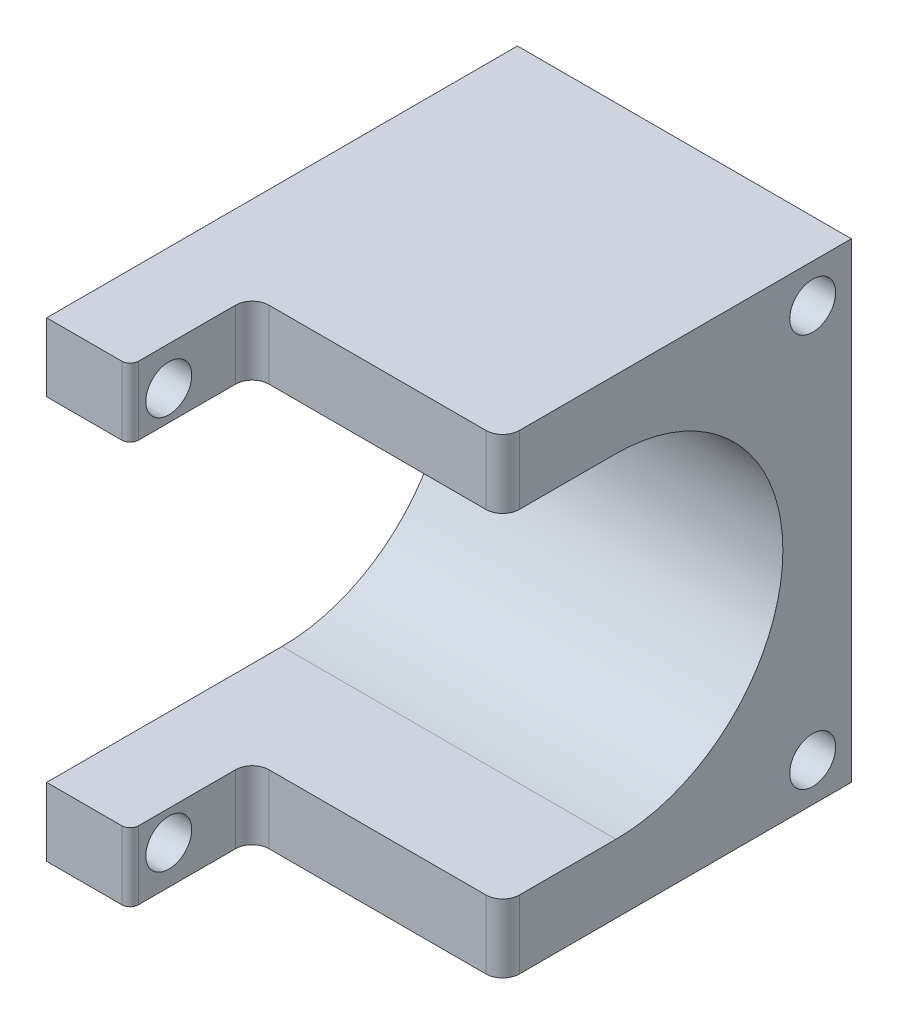
ISO-10303-21;
HEADER;
FILE_DESCRIPTION(('STEP AP214'),'2;1');
FILE_NAME('part.step','',(''),(''),'','','');
FILE_SCHEMA(('AUTOMOTIVE_DESIGN { 1 0 10303 214 1 1 1 1 }'));
ENDSEC;
DATA;
#1=APPLICATION_CONTEXT('core data for automotive mechanical design processes');
#2=APPLICATION_PROTOCOL_DEFINITION('international standard','automotive_design',2000,#1);
#3=PRODUCT_CONTEXT('',#1,'mechanical');
#4=PRODUCT('Part','Part','',(#3));
#5=PRODUCT_RELATED_PRODUCT_CATEGORY('part','',(#4));
#6=PRODUCT_DEFINITION_FORMATION('','',#4);
#7=PRODUCT_DEFINITION_CONTEXT('part definition',#1,'design');
#8=PRODUCT_DEFINITION('design','',#6,#7);
#9=PRODUCT_DEFINITION_SHAPE('','',#8);
#10=(LENGTH_UNIT() NAMED_UNIT(*) SI_UNIT(.MILLI.,.METRE.));
#11=(NAMED_UNIT(*) PLANE_ANGLE_UNIT() SI_UNIT($,.RADIAN.));
#12=(NAMED_UNIT(*) SI_UNIT($,.STERADIAN.) SOLID_ANGLE_UNIT());
#13=UNCERTAINTY_MEASURE_WITH_UNIT(LENGTH_MEASURE(1.E-05),#10,'distance_accuracy_value','');
#14=(GEOMETRIC_REPRESENTATION_CONTEXT(3) GLOBAL_UNCERTAINTY_ASSIGNED_CONTEXT((#13)) GLOBAL_UNIT_ASSIGNED_CONTEXT((#10,
#11,#12)) REPRESENTATION_CONTEXT('',''));
#15=CARTESIAN_POINT('',(0.,0.,0.));
#16=DIRECTION('',(0.,0.,1.));
#17=DIRECTION('',(1.,0.,0.));
#18=AXIS2_PLACEMENT_3D('',#15,#16,#17);
#19=CARTESIAN_POINT('',(40.,1.49681528662421,17.4229299363057));
#20=DIRECTION('',(0.,0.,-1.));
#21=DIRECTION('',(0.,1.,0.));
#22=AXIS2_PLACEMENT_3D('',#19,#20,#21);
#23=PLANE('',#22);
#24=DIRECTION('',(-1.,0.,0.));
#25=VECTOR('',#24,1.);
#26=CARTESIAN_POINT('',(40.,-54.9031847133758,17.4229299363057));
#27=LINE('',#26,#25);
#28=CARTESIAN_POINT('',(9.,-54.9031847133758,17.4229299363057));
#29=VERTEX_POINT('',#28);
#30=CARTESIAN_POINT('',(0.,-54.9031847133758,17.4229299363057));
#31=VERTEX_POINT('',#30);
#32=EDGE_CURVE('E245',#29,#31,#27,.T.);
#33=ORIENTED_EDGE('',*,*,#32,.F.);
#34=DIRECTION('',(0.,1.,0.));
#35=VECTOR('',#34,1.);
#36=CARTESIAN_POINT('',(9.,-46.7031847133758,17.4229299363057));
#37=LINE('',#36,#35);
#38=CARTESIAN_POINT('',(9.,-46.7031847133758,17.4229299363057));
#39=VERTEX_POINT('',#38);
#40=EDGE_CURVE('E285',#29,#39,#37,.T.);
#41=ORIENTED_EDGE('',*,*,#40,.T.);
#42=DIRECTION('',(1.,0.,0.));
#43=VECTOR('',#42,1.);
#44=CARTESIAN_POINT('',(0.,-46.7031847133758,17.4229299363057));
#45=LINE('',#44,#43);
#46=CARTESIAN_POINT('',(0.,-46.7031847133758,17.4229299363057));
#47=VERTEX_POINT('',#46);
#48=EDGE_CURVE('E199',#47,#39,#45,.T.);
#49=ORIENTED_EDGE('',*,*,#48,.F.);
#50=DIRECTION('',(0.,-1.,0.));
#51=VECTOR('',#50,1.);
#52=CARTESIAN_POINT('',(0.,1.49681528662421,17.4229299363057));
#53=LINE('',#52,#51);
#54=EDGE_CURVE('E220',#47,#31,#53,.T.);
#55=ORIENTED_EDGE('',*,*,#54,.T.);
#56=EDGE_LOOP('',(#33,#41,#49,#55));
#57=FACE_BOUND('',#56,.T.);
#58=ADVANCED_FACE('F36',(#57),#23,.F.);
#59=DIRECTION('',(1.,0.,0.));
#60=VECTOR('',#59,1.);
#61=CARTESIAN_POINT('',(0.,-6.70318471337579,17.4229299363057));
#62=LINE('',#61,#60);
#63=CARTESIAN_POINT('',(0.,-6.70318471337579,17.4229299363057));
#64=VERTEX_POINT('',#63);
#65=CARTESIAN_POINT('',(9.,-6.70318471337579,17.4229299363057));
#66=VERTEX_POINT('',#65);
#67=EDGE_CURVE('E172',#64,#66,#62,.T.);
#68=ORIENTED_EDGE('',*,*,#67,.T.);
#69=DIRECTION('',(0.,1.,0.));
#70=VECTOR('',#69,1.);
#71=CARTESIAN_POINT('',(9.,1.49681528662421,17.4229299363057));
#72=LINE('',#71,#70);
#73=CARTESIAN_POINT('',(9.,1.49681528662421,17.4229299363057));
#74=VERTEX_POINT('',#73);
#75=EDGE_CURVE('E294',#66,#74,#72,.T.);
#76=ORIENTED_EDGE('',*,*,#75,.T.);
#77=DIRECTION('',(-1.,0.,0.));
#78=VECTOR('',#77,1.);
#79=CARTESIAN_POINT('',(40.,1.49681528662421,17.4229299363057));
#80=LINE('',#79,#78);
#81=CARTESIAN_POINT('',(0.,1.49681528662421,17.4229299363057));
#82=VERTEX_POINT('',#81);
#83=EDGE_CURVE('E229',#74,#82,#80,.T.);
#84=ORIENTED_EDGE('',*,*,#83,.T.);
#85=EDGE_CURVE('E230',#82,#64,#53,.T.);
#86=ORIENTED_EDGE('',*,*,#85,.T.);
#87=EDGE_LOOP('',(#68,#76,#84,#86));
#88=FACE_BOUND('',#87,.T.);
#89=ADVANCED_FACE('F299',(#88),#23,.F.);
#90=CARTESIAN_POINT('',(0.,-3.13318471337579,12.7929299363057));
#91=DIRECTION('',(1.,0.,0.));
#92=DIRECTION('',(0.,0.,-1.));
#93=AXIS2_PLACEMENT_3D('',#90,#91,#92);
#94=CYLINDRICAL_SURFACE('',#93,2.75);
#95=CARTESIAN_POINT('',(0.,-3.13318471337579,12.7929299363057));
#96=DIRECTION('',(1.,0.,0.));
#97=DIRECTION('',(0.,0.,-1.));
#98=AXIS2_PLACEMENT_3D('',#95,#96,#97);
#99=CIRCLE('',#98,2.75);
#100=CARTESIAN_POINT('',(0.,-3.13318471337579,10.0429299363057));
#101=VERTEX_POINT('',#100);
#102=EDGE_CURVE('E212',#101,#101,#99,.T.);
#103=ORIENTED_EDGE('',*,*,#102,.F.);
#104=EDGE_LOOP('',(#103));
#105=FACE_BOUND('',#104,.T.);
#106=CARTESIAN_POINT('',(10.,-3.13318471337579,12.7929299363057));
#107=DIRECTION('',(1.,0.,0.));
#108=DIRECTION('',(0.,0.,-1.));
#109=AXIS2_PLACEMENT_3D('',#106,#107,#108);
#110=CIRCLE('',#109,2.75);
#111=CARTESIAN_POINT('',(10.,-3.13318471337579,10.0429299363057));
#112=VERTEX_POINT('',#111);
#113=EDGE_CURVE('E354',#112,#112,#110,.F.);
#114=ORIENTED_EDGE('',*,*,#113,.F.);
#115=EDGE_LOOP('',(#114));
#116=FACE_BOUND('',#115,.T.);
#117=ADVANCED_FACE('F373',(#105,#116),#94,.F.);
#118=CARTESIAN_POINT('',(0.,-50.2731847133758,12.7929299363057));
#119=DIRECTION('',(1.,0.,0.));
#120=DIRECTION('',(0.,0.,-1.));
#121=AXIS2_PLACEMENT_3D('',#118,#119,#120);
#122=CYLINDRICAL_SURFACE('',#121,2.75);
#123=CARTESIAN_POINT('',(0.,-50.2731847133758,12.7929299363057));
#124=DIRECTION('',(1.,0.,0.));
#125=DIRECTION('',(0.,0.,1.));
#126=AXIS2_PLACEMENT_3D('',#123,#124,#125);
#127=CIRCLE('',#126,2.75);
#128=CARTESIAN_POINT('',(0.,-50.2731847133758,15.5429299363057));
#129=VERTEX_POINT('',#128);
#130=EDGE_CURVE('E209',#129,#129,#127,.T.);
#131=ORIENTED_EDGE('',*,*,#130,.F.);
#132=EDGE_LOOP('',(#131));
#133=FACE_BOUND('',#132,.T.);
#134=CARTESIAN_POINT('',(10.,-50.2731847133758,12.7929299363057));
#135=DIRECTION('',(1.,0.,0.));
#136=DIRECTION('',(0.,0.,-1.));
#137=AXIS2_PLACEMENT_3D('',#134,#135,#136);
#138=CIRCLE('',#137,2.75);
#139=CARTESIAN_POINT('',(10.,-50.2731847133758,10.0429299363057));
#140=VERTEX_POINT('',#139);
#141=EDGE_CURVE('E190',#140,#140,#138,.F.);
#142=ORIENTED_EDGE('',*,*,#141,.F.);
#143=EDGE_LOOP('',(#142));
#144=FACE_BOUND('',#143,.T.);
#145=ADVANCED_FACE('F371',(#133,#144),#122,.F.);
#146=CARTESIAN_POINT('',(40.,-54.9031847133758,17.4229299363057));
#147=DIRECTION('',(0.,1.,0.));
#148=DIRECTION('',(0.,0.,1.));
#149=AXIS2_PLACEMENT_3D('',#146,#147,#148);
#150=PLANE('',#149);
#151=DIRECTION('',(0.,0.,1.));
#152=VECTOR('',#151,1.);
#153=CARTESIAN_POINT('',(10.,-54.9031847133758,17.4229299363057));
#154=LINE('',#153,#152);
#155=CARTESIAN_POINT('',(10.,-54.9031847133758,4.79292993630573));
#156=VERTEX_POINT('',#155);
#157=CARTESIAN_POINT('',(10.,-54.9031847133758,16.4229299363057));
#158=VERTEX_POINT('',#157);
#159=EDGE_CURVE('E350',#156,#158,#154,.T.);
#160=ORIENTED_EDGE('',*,*,#159,.T.);
#161=CARTESIAN_POINT('',(9.,-54.9031847133758,16.4229299363057));
#162=DIRECTION('',(0.,1.,0.));
#163=DIRECTION('',(0.,0.,1.));
#164=AXIS2_PLACEMENT_3D('',#161,#162,#163);
#165=CIRCLE('',#164,1.);
#166=EDGE_CURVE('E292',#158,#29,#165,.F.);
#167=ORIENTED_EDGE('',*,*,#166,.T.);
#168=ORIENTED_EDGE('',*,*,#32,.T.);
#169=DIRECTION('',(0.,0.,-1.));
#170=VECTOR('',#169,1.);
#171=CARTESIAN_POINT('',(0.,-54.9031847133758,17.4229299363057));
#172=LINE('',#171,#170);
#173=CARTESIAN_POINT('',(0.,-54.9031847133758,-38.9770700636943));
#174=VERTEX_POINT('',#173);
#175=EDGE_CURVE('E232',#31,#174,#172,.T.);
#176=ORIENTED_EDGE('',*,*,#175,.T.);
#177=DIRECTION('',(-1.,0.,0.));
#178=VECTOR('',#177,1.);
#179=CARTESIAN_POINT('',(40.,-54.9031847133758,-38.9770700636943));
#180=LINE('',#179,#178);
#181=CARTESIAN_POINT('',(40.,-54.9031847133758,-38.9770700636943));
#182=VERTEX_POINT('',#181);
#183=EDGE_CURVE('E242',#182,#174,#180,.T.);
#184=ORIENTED_EDGE('',*,*,#183,.F.);
#185=DIRECTION('',(0.,0.,-1.));
#186=VECTOR('',#185,1.);
#187=CARTESIAN_POINT('',(40.,-54.9031847133758,17.4229299363057));
#188=LINE('',#187,#186);
#189=CARTESIAN_POINT('',(40.,-54.9031847133758,0.792929936305732));
#190=VERTEX_POINT('',#189);
#191=EDGE_CURVE('E221',#190,#182,#188,.T.);
#192=ORIENTED_EDGE('',*,*,#191,.F.);
#193=CARTESIAN_POINT('',(38.,-54.9031847133758,0.792929936305727));
#194=DIRECTION('',(0.,1.,0.));
#195=DIRECTION('',(0.,0.,1.));
#196=AXIS2_PLACEMENT_3D('',#193,#194,#195);
#197=CIRCLE('',#196,2.);
#198=CARTESIAN_POINT('',(38.,-54.9031847133758,2.79292993630573));
#199=VERTEX_POINT('',#198);
#200=EDGE_CURVE('E276',#190,#199,#197,.F.);
#201=ORIENTED_EDGE('',*,*,#200,.T.);
#202=DIRECTION('',(1.,0.,0.));
#203=VECTOR('',#202,1.);
#204=CARTESIAN_POINT('',(-16.7713118151205,-54.9031847133758,2.79292993630573));
#205=LINE('',#204,#203);
#206=CARTESIAN_POINT('',(12.,-54.9031847133758,2.79292993630573));
#207=VERTEX_POINT('',#206);
#208=EDGE_CURVE('E360',#207,#199,#205,.T.);
#209=ORIENTED_EDGE('',*,*,#208,.F.);
#210=CARTESIAN_POINT('',(12.,-54.9031847133758,4.79292993630573));
#211=DIRECTION('',(0.,1.,0.));
#212=DIRECTION('',(0.,0.,1.));
#213=AXIS2_PLACEMENT_3D('',#210,#211,#212);
#214=CIRCLE('',#213,2.);
#215=EDGE_CURVE('E259',#207,#156,#214,.T.);
#216=ORIENTED_EDGE('',*,*,#215,.T.);
#217=EDGE_LOOP('',(#160,#167,#168,#176,#184,#192,#201,#209,#216));
#218=FACE_BOUND('',#217,.T.);
#219=ADVANCED_FACE('F315',(#218),#150,.F.);
#220=CARTESIAN_POINT('',(40.,1.49681528662421,-38.9770700636943));
#221=DIRECTION('',(0.,0.,1.));
#222=DIRECTION('',(0.,-1.,0.));
#223=AXIS2_PLACEMENT_3D('',#220,#221,#222);
#224=PLANE('',#223);
#225=DIRECTION('',(0.,1.,0.));
#226=VECTOR('',#225,1.);
#227=CARTESIAN_POINT('',(0.,1.49681528662421,-38.9770700636943));
#228=LINE('',#227,#226);
#229=CARTESIAN_POINT('',(0.,1.49681528662421,-38.9770700636943));
#230=VERTEX_POINT('',#229);
#231=EDGE_CURVE('E234',#174,#230,#228,.T.);
#232=ORIENTED_EDGE('',*,*,#231,.T.);
#233=DIRECTION('',(-1.,0.,0.));
#234=VECTOR('',#233,1.);
#235=CARTESIAN_POINT('',(40.,1.49681528662421,-38.9770700636943));
#236=LINE('',#235,#234);
#237=CARTESIAN_POINT('',(40.,1.49681528662421,-38.9770700636943));
#238=VERTEX_POINT('',#237);
#239=EDGE_CURVE('E239',#238,#230,#236,.T.);
#240=ORIENTED_EDGE('',*,*,#239,.F.);
#241=DIRECTION('',(0.,1.,0.));
#242=VECTOR('',#241,1.);
#243=CARTESIAN_POINT('',(40.,1.49681528662421,-38.9770700636943));
#244=LINE('',#243,#242);
#245=EDGE_CURVE('E223',#182,#238,#244,.T.);
#246=ORIENTED_EDGE('',*,*,#245,.F.);
#247=ORIENTED_EDGE('',*,*,#183,.T.);
#248=EDGE_LOOP('',(#232,#240,#246,#247));
#249=FACE_BOUND('',#248,.T.);
#250=ADVANCED_FACE('F309',(#249),#224,.F.);
#251=CARTESIAN_POINT('',(40.,1.49681528662421,17.4229299363057));
#252=DIRECTION('',(0.,-1.,0.));
#253=DIRECTION('',(0.,0.,-1.));
#254=AXIS2_PLACEMENT_3D('',#251,#252,#253);
#255=PLANE('',#254);
#256=ORIENTED_EDGE('',*,*,#83,.F.);
#257=CARTESIAN_POINT('',(9.,1.49681528662421,16.4229299363057));
#258=DIRECTION('',(0.,-1.,0.));
#259=DIRECTION('',(0.,0.,-1.));
#260=AXIS2_PLACEMENT_3D('',#257,#258,#259);
#261=CIRCLE('',#260,1.);
#262=CARTESIAN_POINT('',(10.,1.49681528662421,16.4229299363057));
#263=VERTEX_POINT('',#262);
#264=EDGE_CURVE('E58',#74,#263,#261,.F.);
#265=ORIENTED_EDGE('',*,*,#264,.T.);
#266=DIRECTION('',(0.,0.,-1.));
#267=VECTOR('',#266,1.);
#268=CARTESIAN_POINT('',(10.,1.49681528662421,17.4229299363057));
#269=LINE('',#268,#267);
#270=CARTESIAN_POINT('',(10.,1.4968152866242,4.79292993630573));
#271=VERTEX_POINT('',#270);
#272=EDGE_CURVE('E346',#263,#271,#269,.T.);
#273=ORIENTED_EDGE('',*,*,#272,.T.);
#274=CARTESIAN_POINT('',(12.,1.49681528662421,4.79292993630573));
#275=DIRECTION('',(0.,-1.,0.));
#276=DIRECTION('',(0.,0.,-1.));
#277=AXIS2_PLACEMENT_3D('',#274,#275,#276);
#278=CIRCLE('',#277,2.);
#279=CARTESIAN_POINT('',(12.,1.4968152866242,2.79292993630573));
#280=VERTEX_POINT('',#279);
#281=EDGE_CURVE('E265',#271,#280,#278,.T.);
#282=ORIENTED_EDGE('',*,*,#281,.T.);
#283=DIRECTION('',(1.,0.,0.));
#284=VECTOR('',#283,1.);
#285=CARTESIAN_POINT('',(-16.7713118151205,1.4968152866242,2.79292993630573));
#286=LINE('',#285,#284);
#287=CARTESIAN_POINT('',(38.,1.4968152866242,2.79292993630573));
#288=VERTEX_POINT('',#287);
#289=EDGE_CURVE('E342',#280,#288,#286,.T.);
#290=ORIENTED_EDGE('',*,*,#289,.T.);
#291=CARTESIAN_POINT('',(38.,1.49681528662421,0.792929936305734));
#292=DIRECTION('',(0.,-1.,0.));
#293=DIRECTION('',(0.,0.,-1.));
#294=AXIS2_PLACEMENT_3D('',#291,#292,#293);
#295=CIRCLE('',#294,2.);
#296=CARTESIAN_POINT('',(40.,1.49681528662421,0.792929936305742));
#297=VERTEX_POINT('',#296);
#298=EDGE_CURVE('E281',#288,#297,#295,.F.);
#299=ORIENTED_EDGE('',*,*,#298,.T.);
#300=DIRECTION('',(0.,0.,1.));
#301=VECTOR('',#300,1.);
#302=CARTESIAN_POINT('',(40.,1.49681528662421,17.4229299363057));
#303=LINE('',#302,#301);
#304=EDGE_CURVE('E226',#238,#297,#303,.T.);
#305=ORIENTED_EDGE('',*,*,#304,.F.);
#306=ORIENTED_EDGE('',*,*,#239,.T.);
#307=DIRECTION('',(0.,0.,1.));
#308=VECTOR('',#307,1.);
#309=CARTESIAN_POINT('',(0.,1.49681528662421,17.4229299363057));
#310=LINE('',#309,#308);
#311=EDGE_CURVE('E224',#230,#82,#310,.T.);
#312=ORIENTED_EDGE('',*,*,#311,.T.);
#313=EDGE_LOOP('',(#256,#265,#273,#282,#290,#299,#305,#306,#312));
#314=FACE_BOUND('',#313,.T.);
#315=ADVANCED_FACE('F302',(#314),#255,.F.);
#316=CARTESIAN_POINT('',(40.,0.,0.));
#317=DIRECTION('',(1.,0.,0.));
#318=DIRECTION('',(0.,0.,-1.));
#319=AXIS2_PLACEMENT_3D('',#316,#317,#318);
#320=PLANE('',#319);
#321=DIRECTION('',(0.,0.,-1.));
#322=VECTOR('',#321,1.);
#323=CARTESIAN_POINT('',(40.,-46.7031847133758,-10.7770700636943));
#324=LINE('',#323,#322);
#325=CARTESIAN_POINT('',(40.,-46.7031847133758,0.792929936305725));
#326=VERTEX_POINT('',#325);
#327=CARTESIAN_POINT('',(40.,-46.7031847133758,-10.7770700636943));
#328=VERTEX_POINT('',#327);
#329=EDGE_CURVE('E185',#326,#328,#324,.T.);
#330=ORIENTED_EDGE('',*,*,#329,.F.);
#331=DIRECTION('',(0.,1.,0.));
#332=VECTOR('',#331,1.);
#333=CARTESIAN_POINT('',(40.,-54.9031847133758,0.792929936305727));
#334=LINE('',#333,#332);
#335=EDGE_CURVE('E274',#326,#190,#334,.F.);
#336=ORIENTED_EDGE('',*,*,#335,.T.);
#337=ORIENTED_EDGE('',*,*,#191,.T.);
#338=ORIENTED_EDGE('',*,*,#245,.T.);
#339=ORIENTED_EDGE('',*,*,#304,.T.);
#340=DIRECTION('',(0.,1.,0.));
#341=VECTOR('',#340,1.);
#342=CARTESIAN_POINT('',(40.,-6.70318471337579,0.792929936305734));
#343=LINE('',#342,#341);
#344=CARTESIAN_POINT('',(40.,-6.70318471337579,0.79292993630573));
#345=VERTEX_POINT('',#344);
#346=EDGE_CURVE('E272',#297,#345,#343,.F.);
#347=ORIENTED_EDGE('',*,*,#346,.T.);
#348=DIRECTION('',(0.,0.,1.));
#349=VECTOR('',#348,1.);
#350=CARTESIAN_POINT('',(40.,-6.70318471337579,-10.7770700636943));
#351=LINE('',#350,#349);
#352=CARTESIAN_POINT('',(40.,-6.70318471337579,-10.7770700636943));
#353=VERTEX_POINT('',#352);
#354=EDGE_CURVE('E187',#353,#345,#351,.T.);
#355=ORIENTED_EDGE('',*,*,#354,.F.);
#356=CARTESIAN_POINT('',(40.,-26.7031847133758,-10.7770700636943));
#357=DIRECTION('',(1.,0.,0.));
#358=DIRECTION('',(0.,0.,-1.));
#359=AXIS2_PLACEMENT_3D('',#356,#357,#358);
#360=CIRCLE('',#359,20.);
#361=EDGE_CURVE('E168',#328,#353,#360,.T.);
#362=ORIENTED_EDGE('',*,*,#361,.F.);
#363=EDGE_LOOP('',(#330,#336,#337,#338,#339,#347,#355,#362));
#364=FACE_BOUND('',#363,.T.);
#365=CARTESIAN_POINT('',(40.,-3.13318471337578,-34.3470700636943));
#366=DIRECTION('',(1.,0.,0.));
#367=DIRECTION('',(0.,0.,1.));
#368=AXIS2_PLACEMENT_3D('',#365,#366,#367);
#369=CIRCLE('',#368,2.75);
#370=CARTESIAN_POINT('',(40.,-3.13318471337578,-31.5970700636943));
#371=VERTEX_POINT('',#370);
#372=EDGE_CURVE('E206',#371,#371,#369,.T.);
#373=ORIENTED_EDGE('',*,*,#372,.F.);
#374=EDGE_LOOP('',(#373));
#375=FACE_BOUND('',#374,.T.);
#376=CARTESIAN_POINT('',(40.,-50.2731847133758,-34.3470700636943));
#377=DIRECTION('',(1.,0.,0.));
#378=DIRECTION('',(0.,0.,-1.));
#379=AXIS2_PLACEMENT_3D('',#376,#377,#378);
#380=CIRCLE('',#379,2.75);
#381=CARTESIAN_POINT('',(40.,-50.2731847133758,-37.0970700636943));
#382=VERTEX_POINT('',#381);
#383=EDGE_CURVE('E198',#382,#382,#380,.T.);
#384=ORIENTED_EDGE('',*,*,#383,.F.);
#385=EDGE_LOOP('',(#384));
#386=FACE_BOUND('',#385,.T.);
#387=ADVANCED_FACE('F328',(#364,#375,#386),#320,.T.);
#388=CARTESIAN_POINT('',(0.,0.,0.));
#389=DIRECTION('',(1.,0.,0.));
#390=DIRECTION('',(0.,0.,-1.));
#391=AXIS2_PLACEMENT_3D('',#388,#389,#390);
#392=PLANE('',#391);
#393=ORIENTED_EDGE('',*,*,#130,.T.);
#394=EDGE_LOOP('',(#393));
#395=FACE_BOUND('',#394,.T.);
#396=CARTESIAN_POINT('',(0.,-3.13318471337578,-34.3470700636943));
#397=DIRECTION('',(1.,0.,0.));
#398=DIRECTION('',(0.,0.,1.));
#399=AXIS2_PLACEMENT_3D('',#396,#397,#398);
#400=CIRCLE('',#399,2.75);
#401=CARTESIAN_POINT('',(0.,-3.13318471337578,-31.5970700636943));
#402=VERTEX_POINT('',#401);
#403=EDGE_CURVE('E213',#402,#402,#400,.T.);
#404=ORIENTED_EDGE('',*,*,#403,.T.);
#405=EDGE_LOOP('',(#404));
#406=FACE_BOUND('',#405,.T.);
#407=CARTESIAN_POINT('',(0.,-50.2731847133758,-34.3470700636943));
#408=DIRECTION('',(1.,0.,0.));
#409=DIRECTION('',(0.,0.,-1.));
#410=AXIS2_PLACEMENT_3D('',#407,#408,#409);
#411=CIRCLE('',#410,2.75);
#412=CARTESIAN_POINT('',(0.,-50.2731847133758,-37.0970700636943));
#413=VERTEX_POINT('',#412);
#414=EDGE_CURVE('E203',#413,#413,#411,.T.);
#415=ORIENTED_EDGE('',*,*,#414,.T.);
#416=EDGE_LOOP('',(#415));
#417=FACE_BOUND('',#416,.T.);
#418=ORIENTED_EDGE('',*,*,#102,.T.);
#419=EDGE_LOOP('',(#418));
#420=FACE_BOUND('',#419,.T.);
#421=ORIENTED_EDGE('',*,*,#54,.F.);
#422=DIRECTION('',(0.,0.,-1.));
#423=VECTOR('',#422,1.);
#424=CARTESIAN_POINT('',(0.,-46.7031847133758,-10.7770700636943));
#425=LINE('',#424,#423);
#426=CARTESIAN_POINT('',(0.,-46.7031847133758,-10.7770700636943));
#427=VERTEX_POINT('',#426);
#428=EDGE_CURVE('E173',#47,#427,#425,.T.);
#429=ORIENTED_EDGE('',*,*,#428,.T.);
#430=CARTESIAN_POINT('',(0.,-26.7031847133758,-10.7770700636943));
#431=DIRECTION('',(1.,0.,0.));
#432=DIRECTION('',(0.,0.,-1.));
#433=AXIS2_PLACEMENT_3D('',#430,#431,#432);
#434=CIRCLE('',#433,20.);
#435=CARTESIAN_POINT('',(0.,-6.70318471337579,-10.7770700636943));
#436=VERTEX_POINT('',#435);
#437=EDGE_CURVE('E165',#427,#436,#434,.T.);
#438=ORIENTED_EDGE('',*,*,#437,.T.);
#439=DIRECTION('',(0.,0.,1.));
#440=VECTOR('',#439,1.);
#441=CARTESIAN_POINT('',(0.,-6.70318471337579,-10.7770700636943));
#442=LINE('',#441,#440);
#443=EDGE_CURVE('E176',#436,#64,#442,.T.);
#444=ORIENTED_EDGE('',*,*,#443,.T.);
#445=ORIENTED_EDGE('',*,*,#85,.F.);
#446=ORIENTED_EDGE('',*,*,#311,.F.);
#447=ORIENTED_EDGE('',*,*,#231,.F.);
#448=ORIENTED_EDGE('',*,*,#175,.F.);
#449=EDGE_LOOP('',(#421,#429,#438,#444,#445,#446,#447,#448));
#450=FACE_BOUND('',#449,.T.);
#451=ADVANCED_FACE('F184',(#395,#406,#417,#420,#450),#392,.F.);
#452=CARTESIAN_POINT('',(0.,-50.2731847133758,-34.3470700636943));
#453=DIRECTION('',(1.,0.,0.));
#454=DIRECTION('',(0.,0.,-1.));
#455=AXIS2_PLACEMENT_3D('',#452,#453,#454);
#456=CYLINDRICAL_SURFACE('',#455,2.75);
#457=ORIENTED_EDGE('',*,*,#414,.F.);
#458=EDGE_LOOP('',(#457));
#459=FACE_BOUND('',#458,.T.);
#460=ORIENTED_EDGE('',*,*,#383,.T.);
#461=EDGE_LOOP('',(#460));
#462=FACE_BOUND('',#461,.T.);
#463=ADVANCED_FACE('F438',(#459,#462),#456,.F.);
#464=CARTESIAN_POINT('',(0.,-3.13318471337578,-34.3470700636943));
#465=DIRECTION('',(1.,0.,0.));
#466=DIRECTION('',(0.,0.,-1.));
#467=AXIS2_PLACEMENT_3D('',#464,#465,#466);
#468=CYLINDRICAL_SURFACE('',#467,2.75);
#469=ORIENTED_EDGE('',*,*,#403,.F.);
#470=EDGE_LOOP('',(#469));
#471=FACE_BOUND('',#470,.T.);
#472=ORIENTED_EDGE('',*,*,#372,.T.);
#473=EDGE_LOOP('',(#472));
#474=FACE_BOUND('',#473,.T.);
#475=ADVANCED_FACE('F437',(#471,#474),#468,.F.);
#476=CARTESIAN_POINT('',(0.,-26.7031847133758,-10.7770700636943));
#477=DIRECTION('',(1.,0.,0.));
#478=DIRECTION('',(0.,0.,-1.));
#479=AXIS2_PLACEMENT_3D('',#476,#477,#478);
#480=CYLINDRICAL_SURFACE('',#479,20.);
#481=ORIENTED_EDGE('',*,*,#361,.T.);
#482=DIRECTION('',(1.,0.,0.));
#483=VECTOR('',#482,1.);
#484=CARTESIAN_POINT('',(0.,-6.70318471337579,-10.7770700636943));
#485=LINE('',#484,#483);
#486=EDGE_CURVE('E160',#436,#353,#485,.T.);
#487=ORIENTED_EDGE('',*,*,#486,.F.);
#488=ORIENTED_EDGE('',*,*,#437,.F.);
#489=DIRECTION('',(1.,0.,0.));
#490=VECTOR('',#489,1.);
#491=CARTESIAN_POINT('',(0.,-46.7031847133758,-10.7770700636943));
#492=LINE('',#491,#490);
#493=EDGE_CURVE('E196',#427,#328,#492,.T.);
#494=ORIENTED_EDGE('',*,*,#493,.T.);
#495=EDGE_LOOP('',(#481,#487,#488,#494));
#496=FACE_BOUND('',#495,.T.);
#497=ADVANCED_FACE('F162',(#496),#480,.F.);
#498=CARTESIAN_POINT('',(0.,-46.7031847133758,-10.7770700636943));
#499=DIRECTION('',(0.,-1.,0.));
#500=DIRECTION('',(0.,0.,-1.));
#501=AXIS2_PLACEMENT_3D('',#498,#499,#500);
#502=PLANE('',#501);
#503=ORIENTED_EDGE('',*,*,#48,.T.);
#504=CARTESIAN_POINT('',(9.,-46.7031847133758,16.4229299363057));
#505=DIRECTION('',(0.,-1.,0.));
#506=DIRECTION('',(0.,0.,-1.));
#507=AXIS2_PLACEMENT_3D('',#504,#505,#506);
#508=CIRCLE('',#507,1.);
#509=CARTESIAN_POINT('',(10.,-46.7031847133758,16.4229299363057));
#510=VERTEX_POINT('',#509);
#511=EDGE_CURVE('E288',#39,#510,#508,.F.);
#512=ORIENTED_EDGE('',*,*,#511,.T.);
#513=DIRECTION('',(0.,0.,-1.));
#514=VECTOR('',#513,1.);
#515=CARTESIAN_POINT('',(10.,-46.7031847133758,17.4229299363057));
#516=LINE('',#515,#514);
#517=CARTESIAN_POINT('',(10.,-46.7031847133758,4.79292993630573));
#518=VERTEX_POINT('',#517);
#519=EDGE_CURVE('E355',#510,#518,#516,.T.);
#520=ORIENTED_EDGE('',*,*,#519,.T.);
#521=CARTESIAN_POINT('',(12.,-46.7031847133758,4.79292993630573));
#522=DIRECTION('',(0.,-1.,0.));
#523=DIRECTION('',(0.,0.,-1.));
#524=AXIS2_PLACEMENT_3D('',#521,#522,#523);
#525=CIRCLE('',#524,2.);
#526=CARTESIAN_POINT('',(12.,-46.7031847133758,2.79292993630573));
#527=VERTEX_POINT('',#526);
#528=EDGE_CURVE('E261',#518,#527,#525,.T.);
#529=ORIENTED_EDGE('',*,*,#528,.T.);
#530=DIRECTION('',(1.,0.,0.));
#531=VECTOR('',#530,1.);
#532=CARTESIAN_POINT('',(-16.7713118151205,-46.7031847133758,2.79292993630573));
#533=LINE('',#532,#531);
#534=CARTESIAN_POINT('',(38.,-46.7031847133758,2.79292993630573));
#535=VERTEX_POINT('',#534);
#536=EDGE_CURVE('E357',#527,#535,#533,.T.);
#537=ORIENTED_EDGE('',*,*,#536,.T.);
#538=CARTESIAN_POINT('',(38.,-46.7031847133758,0.792929936305729));
#539=DIRECTION('',(0.,-1.,0.));
#540=DIRECTION('',(0.,0.,-1.));
#541=AXIS2_PLACEMENT_3D('',#538,#539,#540);
#542=CIRCLE('',#541,2.);
#543=EDGE_CURVE('E270',#535,#326,#542,.F.);
#544=ORIENTED_EDGE('',*,*,#543,.T.);
#545=ORIENTED_EDGE('',*,*,#329,.T.);
#546=ORIENTED_EDGE('',*,*,#493,.F.);
#547=ORIENTED_EDGE('',*,*,#428,.F.);
#548=EDGE_LOOP('',(#503,#512,#520,#529,#537,#544,#545,#546,#547));
#549=FACE_BOUND('',#548,.T.);
#550=ADVANCED_FACE('F324',(#549),#502,.F.);
#551=CARTESIAN_POINT('',(0.,-6.70318471337579,-10.7770700636943));
#552=DIRECTION('',(0.,1.,0.));
#553=DIRECTION('',(0.,0.,1.));
#554=AXIS2_PLACEMENT_3D('',#551,#552,#553);
#555=PLANE('',#554);
#556=DIRECTION('',(0.,0.,1.));
#557=VECTOR('',#556,1.);
#558=CARTESIAN_POINT('',(10.,-6.70318471337579,17.4229299363057));
#559=LINE('',#558,#557);
#560=CARTESIAN_POINT('',(10.,-6.70318471337579,4.79292993630573));
#561=VERTEX_POINT('',#560);
#562=CARTESIAN_POINT('',(10.,-6.70318471337579,16.4229299363057));
#563=VERTEX_POINT('',#562);
#564=EDGE_CURVE('E348',#561,#563,#559,.T.);
#565=ORIENTED_EDGE('',*,*,#564,.T.);
#566=CARTESIAN_POINT('',(9.,-6.70318471337579,16.4229299363057));
#567=DIRECTION('',(0.,1.,0.));
#568=DIRECTION('',(0.,0.,1.));
#569=AXIS2_PLACEMENT_3D('',#566,#567,#568);
#570=CIRCLE('',#569,1.);
#571=EDGE_CURVE('E12',#563,#66,#570,.F.);
#572=ORIENTED_EDGE('',*,*,#571,.T.);
#573=ORIENTED_EDGE('',*,*,#67,.F.);
#574=ORIENTED_EDGE('',*,*,#443,.F.);
#575=ORIENTED_EDGE('',*,*,#486,.T.);
#576=ORIENTED_EDGE('',*,*,#354,.T.);
#577=CARTESIAN_POINT('',(38.,-6.70318471337579,0.792929936305734));
#578=DIRECTION('',(0.,1.,0.));
#579=DIRECTION('',(0.,0.,1.));
#580=AXIS2_PLACEMENT_3D('',#577,#578,#579);
#581=CIRCLE('',#580,2.);
#582=CARTESIAN_POINT('',(38.,-6.70318471337579,2.79292993630573));
#583=VERTEX_POINT('',#582);
#584=EDGE_CURVE('E283',#345,#583,#581,.F.);
#585=ORIENTED_EDGE('',*,*,#584,.T.);
#586=DIRECTION('',(1.,0.,0.));
#587=VECTOR('',#586,1.);
#588=CARTESIAN_POINT('',(-16.7713118151205,-6.70318471337579,2.79292993630573));
#589=LINE('',#588,#587);
#590=CARTESIAN_POINT('',(12.,-6.70318471337579,2.79292993630573));
#591=VERTEX_POINT('',#590);
#592=EDGE_CURVE('E344',#591,#583,#589,.T.);
#593=ORIENTED_EDGE('',*,*,#592,.F.);
#594=CARTESIAN_POINT('',(12.,-6.70318471337579,4.79292993630573));
#595=DIRECTION('',(0.,1.,0.));
#596=DIRECTION('',(0.,0.,1.));
#597=AXIS2_PLACEMENT_3D('',#594,#595,#596);
#598=CIRCLE('',#597,2.);
#599=EDGE_CURVE('E263',#591,#561,#598,.T.);
#600=ORIENTED_EDGE('',*,*,#599,.T.);
#601=EDGE_LOOP('',(#565,#572,#573,#574,#575,#576,#585,#593,#600));
#602=FACE_BOUND('',#601,.T.);
#603=ADVANCED_FACE('F177',(#602),#555,.F.);
#604=CARTESIAN_POINT('',(10.,0.,0.));
#605=DIRECTION('',(1.,0.,0.));
#606=DIRECTION('',(0.,0.,-1.));
#607=AXIS2_PLACEMENT_3D('',#604,#605,#606);
#608=PLANE('',#607);
#609=ORIENTED_EDGE('',*,*,#272,.F.);
#610=DIRECTION('',(0.,1.,0.));
#611=VECTOR('',#610,1.);
#612=CARTESIAN_POINT('',(10.,-6.70318471337579,16.4229299363057));
#613=LINE('',#612,#611);
#614=EDGE_CURVE('E44',#263,#563,#613,.F.);
#615=ORIENTED_EDGE('',*,*,#614,.T.);
#616=ORIENTED_EDGE('',*,*,#564,.F.);
#617=DIRECTION('',(0.,-1.,0.));
#618=VECTOR('',#617,1.);
#619=CARTESIAN_POINT('',(10.,0.,4.79292993630573));
#620=LINE('',#619,#618);
#621=EDGE_CURVE('E256',#561,#271,#620,.F.);
#622=ORIENTED_EDGE('',*,*,#621,.T.);
#623=EDGE_LOOP('',(#609,#615,#616,#622));
#624=FACE_BOUND('',#623,.T.);
#625=ORIENTED_EDGE('',*,*,#113,.T.);
#626=EDGE_LOOP('',(#625));
#627=FACE_BOUND('',#626,.T.);
#628=ADVANCED_FACE('F435',(#624,#627),#608,.T.);
#629=CARTESIAN_POINT('',(-16.7713118151205,-6.70318471337579,2.79292993630573));
#630=DIRECTION('',(0.,0.,-1.));
#631=DIRECTION('',(-1.,0.,0.));
#632=AXIS2_PLACEMENT_3D('',#629,#630,#631);
#633=PLANE('',#632);
#634=ORIENTED_EDGE('',*,*,#592,.T.);
#635=DIRECTION('',(0.,1.,0.));
#636=VECTOR('',#635,1.);
#637=CARTESIAN_POINT('',(38.,1.4968152866242,2.79292993630573));
#638=LINE('',#637,#636);
#639=EDGE_CURVE('E278',#583,#288,#638,.T.);
#640=ORIENTED_EDGE('',*,*,#639,.T.);
#641=ORIENTED_EDGE('',*,*,#289,.F.);
#642=DIRECTION('',(0.,-1.,0.));
#643=VECTOR('',#642,1.);
#644=CARTESIAN_POINT('',(12.,-6.70318471337579,2.79292993630573));
#645=LINE('',#644,#643);
#646=EDGE_CURVE('E253',#280,#591,#645,.T.);
#647=ORIENTED_EDGE('',*,*,#646,.T.);
#648=EDGE_LOOP('',(#634,#640,#641,#647));
#649=FACE_BOUND('',#648,.T.);
#650=ADVANCED_FACE('F341',(#649),#633,.F.);
#651=CARTESIAN_POINT('',(10.,0.,0.));
#652=DIRECTION('',(1.,0.,0.));
#653=DIRECTION('',(0.,0.,-1.));
#654=AXIS2_PLACEMENT_3D('',#651,#652,#653);
#655=PLANE('',#654);
#656=ORIENTED_EDGE('',*,*,#519,.F.);
#657=DIRECTION('',(0.,1.,0.));
#658=VECTOR('',#657,1.);
#659=CARTESIAN_POINT('',(10.,-54.9031847133758,16.4229299363057));
#660=LINE('',#659,#658);
#661=EDGE_CURVE('E290',#510,#158,#660,.F.);
#662=ORIENTED_EDGE('',*,*,#661,.T.);
#663=ORIENTED_EDGE('',*,*,#159,.F.);
#664=DIRECTION('',(0.,-1.,0.));
#665=VECTOR('',#664,1.);
#666=CARTESIAN_POINT('',(10.,0.,4.79292993630574));
#667=LINE('',#666,#665);
#668=EDGE_CURVE('E250',#156,#518,#667,.F.);
#669=ORIENTED_EDGE('',*,*,#668,.T.);
#670=EDGE_LOOP('',(#656,#662,#663,#669));
#671=FACE_BOUND('',#670,.T.);
#672=ORIENTED_EDGE('',*,*,#141,.T.);
#673=EDGE_LOOP('',(#672));
#674=FACE_BOUND('',#673,.T.);
#675=ADVANCED_FACE('F369',(#671,#674),#655,.T.);
#676=CARTESIAN_POINT('',(-16.7713118151205,-46.7031847133758,2.79292993630573));
#677=DIRECTION('',(0.,0.,-1.));
#678=DIRECTION('',(0.,1.,0.));
#679=AXIS2_PLACEMENT_3D('',#676,#677,#678);
#680=PLANE('',#679);
#681=ORIENTED_EDGE('',*,*,#208,.T.);
#682=DIRECTION('',(0.,1.,0.));
#683=VECTOR('',#682,1.);
#684=CARTESIAN_POINT('',(38.,-46.7031847133758,2.79292993630573));
#685=LINE('',#684,#683);
#686=EDGE_CURVE('E267',#199,#535,#685,.T.);
#687=ORIENTED_EDGE('',*,*,#686,.T.);
#688=ORIENTED_EDGE('',*,*,#536,.F.);
#689=DIRECTION('',(0.,-1.,0.));
#690=VECTOR('',#689,1.);
#691=CARTESIAN_POINT('',(12.,-46.7031847133758,2.79292993630573));
#692=LINE('',#691,#690);
#693=EDGE_CURVE('E247',#527,#207,#692,.T.);
#694=ORIENTED_EDGE('',*,*,#693,.T.);
#695=EDGE_LOOP('',(#681,#687,#688,#694));
#696=FACE_BOUND('',#695,.T.);
#697=ADVANCED_FACE('F397',(#696),#680,.F.);
#698=CARTESIAN_POINT('',(12.,-46.7031847133758,4.79292993630573));
#699=DIRECTION('',(0.,-1.,0.));
#700=DIRECTION('',(0.,0.,-1.));
#701=AXIS2_PLACEMENT_3D('',#698,#699,#700);
#702=CYLINDRICAL_SURFACE('',#701,2.);
#703=ORIENTED_EDGE('',*,*,#528,.F.);
#704=ORIENTED_EDGE('',*,*,#668,.F.);
#705=ORIENTED_EDGE('',*,*,#215,.F.);
#706=ORIENTED_EDGE('',*,*,#693,.F.);
#707=EDGE_LOOP('',(#703,#704,#705,#706));
#708=FACE_BOUND('',#707,.T.);
#709=ADVANCED_FACE('F393',(#708),#702,.F.);
#710=CARTESIAN_POINT('',(12.,-6.70318471337579,4.79292993630573));
#711=DIRECTION('',(0.,-1.,0.));
#712=DIRECTION('',(0.,0.,-1.));
#713=AXIS2_PLACEMENT_3D('',#710,#711,#712);
#714=CYLINDRICAL_SURFACE('',#713,2.);
#715=ORIENTED_EDGE('',*,*,#281,.F.);
#716=ORIENTED_EDGE('',*,*,#621,.F.);
#717=ORIENTED_EDGE('',*,*,#599,.F.);
#718=ORIENTED_EDGE('',*,*,#646,.F.);
#719=EDGE_LOOP('',(#715,#716,#717,#718));
#720=FACE_BOUND('',#719,.T.);
#721=ADVANCED_FACE('F396',(#720),#714,.F.);
#722=CARTESIAN_POINT('',(38.,-46.7031847133758,0.792929936305729));
#723=DIRECTION('',(0.,-1.,0.));
#724=DIRECTION('',(0.,0.,-1.));
#725=AXIS2_PLACEMENT_3D('',#722,#723,#724);
#726=CYLINDRICAL_SURFACE('',#725,2.);
#727=ORIENTED_EDGE('',*,*,#200,.F.);
#728=ORIENTED_EDGE('',*,*,#335,.F.);
#729=ORIENTED_EDGE('',*,*,#543,.F.);
#730=ORIENTED_EDGE('',*,*,#686,.F.);
#731=EDGE_LOOP('',(#727,#728,#729,#730));
#732=FACE_BOUND('',#731,.T.);
#733=ADVANCED_FACE('F401',(#732),#726,.T.);
#734=CARTESIAN_POINT('',(38.,-6.70318471337579,0.792929936305734));
#735=DIRECTION('',(0.,-1.,0.));
#736=DIRECTION('',(0.,0.,-1.));
#737=AXIS2_PLACEMENT_3D('',#734,#735,#736);
#738=CYLINDRICAL_SURFACE('',#737,2.);
#739=ORIENTED_EDGE('',*,*,#584,.F.);
#740=ORIENTED_EDGE('',*,*,#346,.F.);
#741=ORIENTED_EDGE('',*,*,#298,.F.);
#742=ORIENTED_EDGE('',*,*,#639,.F.);
#743=EDGE_LOOP('',(#739,#740,#741,#742));
#744=FACE_BOUND('',#743,.T.);
#745=ADVANCED_FACE('F337',(#744),#738,.T.);
#746=CARTESIAN_POINT('',(9.,1.49681528662421,16.4229299363057));
#747=DIRECTION('',(0.,-1.,0.));
#748=DIRECTION('',(0.,0.,-1.));
#749=AXIS2_PLACEMENT_3D('',#746,#747,#748);
#750=CYLINDRICAL_SURFACE('',#749,1.);
#751=ORIENTED_EDGE('',*,*,#166,.F.);
#752=ORIENTED_EDGE('',*,*,#661,.F.);
#753=ORIENTED_EDGE('',*,*,#511,.F.);
#754=ORIENTED_EDGE('',*,*,#40,.F.);
#755=EDGE_LOOP('',(#751,#752,#753,#754));
#756=FACE_BOUND('',#755,.T.);
#757=ADVANCED_FACE('F407',(#756),#750,.T.);
#758=CARTESIAN_POINT('',(9.,1.49681528662421,16.4229299363057));
#759=DIRECTION('',(0.,-1.,0.));
#760=DIRECTION('',(0.,0.,-1.));
#761=AXIS2_PLACEMENT_3D('',#758,#759,#760);
#762=CYLINDRICAL_SURFACE('',#761,1.);
#763=ORIENTED_EDGE('',*,*,#571,.F.);
#764=ORIENTED_EDGE('',*,*,#614,.F.);
#765=ORIENTED_EDGE('',*,*,#264,.F.);
#766=ORIENTED_EDGE('',*,*,#75,.F.);
#767=EDGE_LOOP('',(#763,#764,#765,#766));
#768=FACE_BOUND('',#767,.T.);
#769=ADVANCED_FACE('F38',(#768),#762,.T.);
#770=CLOSED_SHELL('',(#58,#89,#117,#145,#219,#250,#315,#387,#451,#463,#475,#497,#550,#603,#628,
#650,#675,#697,#709,#721,#733,#745,#757,#769));
#771=MANIFOLD_SOLID_BREP('B2',#770);
#772=ADVANCED_BREP_SHAPE_REPRESENTATION('',(#18,#771),#14);
#773=SHAPE_DEFINITION_REPRESENTATION(#9,#772);
ENDSEC;
END-ISO-10303-21;
